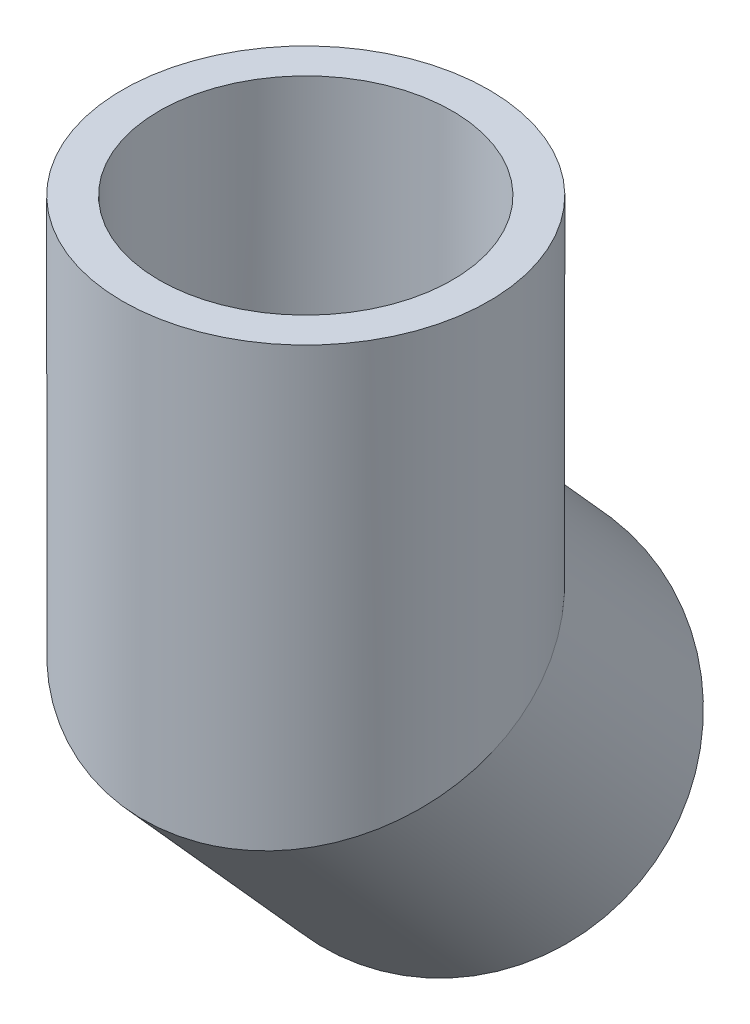
ISO-10303-21;
HEADER;
FILE_DESCRIPTION(('STEP AP214'),'2;1');
FILE_NAME('part.step','',(''),(''),'','','');
FILE_SCHEMA(('AUTOMOTIVE_DESIGN { 1 0 10303 214 1 1 1 1 }'));
ENDSEC;
DATA;
#1=APPLICATION_CONTEXT('core data for automotive mechanical design processes');
#2=APPLICATION_PROTOCOL_DEFINITION('international standard','automotive_design',2000,#1);
#3=PRODUCT_CONTEXT('',#1,'mechanical');
#4=PRODUCT('Part','Part','',(#3));
#5=PRODUCT_RELATED_PRODUCT_CATEGORY('part','',(#4));
#6=PRODUCT_DEFINITION_FORMATION('','',#4);
#7=PRODUCT_DEFINITION_CONTEXT('part definition',#1,'design');
#8=PRODUCT_DEFINITION('design','',#6,#7);
#9=PRODUCT_DEFINITION_SHAPE('','',#8);
#10=(LENGTH_UNIT() NAMED_UNIT(*) SI_UNIT(.MILLI.,.METRE.));
#11=(NAMED_UNIT(*) PLANE_ANGLE_UNIT() SI_UNIT($,.RADIAN.));
#12=(NAMED_UNIT(*) SI_UNIT($,.STERADIAN.) SOLID_ANGLE_UNIT());
#13=UNCERTAINTY_MEASURE_WITH_UNIT(LENGTH_MEASURE(1.E-05),#10,'distance_accuracy_value','');
#14=(GEOMETRIC_REPRESENTATION_CONTEXT(3) GLOBAL_UNCERTAINTY_ASSIGNED_CONTEXT((#13)) GLOBAL_UNIT_ASSIGNED_CONTEXT((#10,
#11,#12)) REPRESENTATION_CONTEXT('',''));
#15=CARTESIAN_POINT('',(0.,0.,0.));
#16=DIRECTION('',(0.,0.,1.));
#17=DIRECTION('',(1.,0.,0.));
#18=AXIS2_PLACEMENT_3D('',#15,#16,#17);
#19=CARTESIAN_POINT('',(2.39228867088973,-18.2937120751138,6.26508201435606));
#20=DIRECTION('',(-0.252241412937929,-0.707106781186546,-0.660586307456549));
#21=DIRECTION('',(0.,0.682660590064805,-0.730735601139271));
#22=AXIS2_PLACEMENT_3D('',#19,#20,#21);
#23=CYLINDRICAL_SURFACE('',#22,12.5);
#24=CARTESIAN_POINT('',(0.,-25.,0.));
#25=DIRECTION('',(-0.136512068977374,-0.923879532511286,-0.357506733405461));
#26=DIRECTION('',(0.329569288352787,-0.382683432365091,0.863097604427165));
#27=AXIS2_PLACEMENT_3D('',#24,#25,#26);
#28=ELLIPSE('',#27,13.5299025036549,12.5);
#29=CARTESIAN_POINT('',(4.45904033961214,-30.1776695296637,11.6776264390377));
#30=VERTEX_POINT('',#29);
#31=EDGE_CURVE('E40',#30,#30,#28,.T.);
#32=ORIENTED_EDGE('',*,*,#31,.T.);
#33=EDGE_LOOP('',(#32));
#34=FACE_BOUND('',#33,.T.);
#35=CARTESIAN_POINT('',(-6.30603532344823,-42.6776695296637,-16.5146576864137));
#36=DIRECTION('',(0.252241412937929,0.707106781186546,0.660586307456549));
#37=DIRECTION('',(-0.0976079677010439,-0.660586307456549,0.744377871139513));
#38=AXIS2_PLACEMENT_3D('',#35,#36,#37);
#39=CIRCLE('',#38,12.5);
#40=CARTESIAN_POINT('',(-7.52613491971128,-50.9349983728705,-7.20993429716981));
#41=VERTEX_POINT('',#40);
#42=EDGE_CURVE('E60',#41,#41,#39,.T.);
#43=ORIENTED_EDGE('',*,*,#42,.T.);
#44=EDGE_LOOP('',(#43));
#45=FACE_BOUND('',#44,.T.);
#46=ADVANCED_FACE('F37',(#34,#45),#23,.T.);
#47=CARTESIAN_POINT('',(0.,0.,0.));
#48=DIRECTION('',(0.,-1.,0.));
#49=DIRECTION('',(1.,0.,0.));
#50=AXIS2_PLACEMENT_3D('',#47,#48,#49);
#51=CYLINDRICAL_SURFACE('',#50,12.5);
#52=CARTESIAN_POINT('',(0.,0.,0.));
#53=DIRECTION('',(0.,1.,0.));
#54=DIRECTION('',(0.,0.,1.));
#55=AXIS2_PLACEMENT_3D('',#52,#53,#54);
#56=CIRCLE('',#55,12.5);
#57=CARTESIAN_POINT('',(0.,0.,12.5));
#58=VERTEX_POINT('',#57);
#59=EDGE_CURVE('E57',#58,#58,#56,.T.);
#60=ORIENTED_EDGE('',*,*,#59,.F.);
#61=EDGE_LOOP('',(#60));
#62=FACE_BOUND('',#61,.T.);
#63=ORIENTED_EDGE('',*,*,#31,.F.);
#64=EDGE_LOOP('',(#63));
#65=FACE_BOUND('',#64,.T.);
#66=ADVANCED_FACE('F70',(#62,#65),#51,.T.);
#67=CARTESIAN_POINT('',(-6.30603532344823,-42.6776695296637,-16.5146576864137));
#68=DIRECTION('',(0.252241412937929,0.707106781186546,0.660586307456549));
#69=DIRECTION('',(-0.0976079677010439,-0.660586307456549,0.744377871139513));
#70=AXIS2_PLACEMENT_3D('',#67,#68,#69);
#71=PLANE('',#70);
#72=CARTESIAN_POINT('',(-6.30603532344823,-42.6776695296637,-16.5146576864137));
#73=DIRECTION('',(0.252241412937929,0.707106781186546,0.660586307456549));
#74=DIRECTION('',(-0.0976079677010439,-0.660586307456549,0.744377871139513));
#75=AXIS2_PLACEMENT_3D('',#72,#73,#74);
#76=CIRCLE('',#75,10.);
#77=CARTESIAN_POINT('',(-7.28211500045867,-49.2835326042292,-9.07087897501859));
#78=VERTEX_POINT('',#77);
#79=EDGE_CURVE('E51',#78,#78,#76,.F.);
#80=ORIENTED_EDGE('',*,*,#79,.F.);
#81=EDGE_LOOP('',(#80));
#82=FACE_BOUND('',#81,.T.);
#83=ORIENTED_EDGE('',*,*,#42,.F.);
#84=EDGE_LOOP('',(#83));
#85=FACE_BOUND('',#84,.T.);
#86=ADVANCED_FACE('F72',(#82,#85),#71,.F.);
#87=CARTESIAN_POINT('',(0.,0.,0.));
#88=DIRECTION('',(0.,1.,0.));
#89=DIRECTION('',(0.,0.,1.));
#90=AXIS2_PLACEMENT_3D('',#87,#88,#89);
#91=PLANE('',#90);
#92=CARTESIAN_POINT('',(0.,0.,0.));
#93=DIRECTION('',(0.,1.,0.));
#94=DIRECTION('',(0.,0.,1.));
#95=AXIS2_PLACEMENT_3D('',#92,#93,#94);
#96=CIRCLE('',#95,10.);
#97=CARTESIAN_POINT('',(0.,0.,10.));
#98=VERTEX_POINT('',#97);
#99=EDGE_CURVE('E45',#98,#98,#96,.F.);
#100=ORIENTED_EDGE('',*,*,#99,.T.);
#101=EDGE_LOOP('',(#100));
#102=FACE_BOUND('',#101,.T.);
#103=ORIENTED_EDGE('',*,*,#59,.T.);
#104=EDGE_LOOP('',(#103));
#105=FACE_BOUND('',#104,.T.);
#106=ADVANCED_FACE('F78',(#102,#105),#91,.T.);
#107=CARTESIAN_POINT('',(1.91887576497054,-19.6208275244673,5.02527733763398));
#108=DIRECTION('',(-0.252241412937929,-0.707106781186546,-0.660586307456549));
#109=DIRECTION('',(0.,0.682660590064805,-0.730735601139271));
#110=AXIS2_PLACEMENT_3D('',#107,#108,#109);
#111=CYLINDRICAL_SURFACE('',#110,10.);
#112=CARTESIAN_POINT('',(0.,-25.,0.));
#113=DIRECTION('',(-0.136512068977374,-0.923879532511286,-0.357506733405461));
#114=DIRECTION('',(0.329569288352787,-0.382683432365091,0.863097604427165));
#115=AXIS2_PLACEMENT_3D('',#112,#113,#114);
#116=ELLIPSE('',#115,10.8239220029239,10.);
#117=CARTESIAN_POINT('',(3.56723227168972,-29.142135623731,9.34210115123014));
#118=VERTEX_POINT('',#117);
#119=EDGE_CURVE('E10',#118,#118,#116,.F.);
#120=ORIENTED_EDGE('',*,*,#119,.T.);
#121=EDGE_LOOP('',(#120));
#122=FACE_BOUND('',#121,.T.);
#123=ORIENTED_EDGE('',*,*,#79,.T.);
#124=EDGE_LOOP('',(#123));
#125=FACE_BOUND('',#124,.T.);
#126=ADVANCED_FACE('F84',(#122,#125),#111,.F.);
#127=CARTESIAN_POINT('',(0.,0.,0.));
#128=DIRECTION('',(0.,-1.,0.));
#129=DIRECTION('',(1.,0.,0.));
#130=AXIS2_PLACEMENT_3D('',#127,#128,#129);
#131=CYLINDRICAL_SURFACE('',#130,10.);
#132=ORIENTED_EDGE('',*,*,#99,.F.);
#133=EDGE_LOOP('',(#132));
#134=FACE_BOUND('',#133,.T.);
#135=ORIENTED_EDGE('',*,*,#119,.F.);
#136=EDGE_LOOP('',(#135));
#137=FACE_BOUND('',#136,.T.);
#138=ADVANCED_FACE('F82',(#134,#137),#131,.F.);
#139=CLOSED_SHELL('',(#46,#66,#86,#106,#126,#138));
#140=MANIFOLD_SOLID_BREP('B2',#139);
#141=ADVANCED_BREP_SHAPE_REPRESENTATION('',(#18,#140),#14);
#142=SHAPE_DEFINITION_REPRESENTATION(#9,#141);
ENDSEC;
END-ISO-10303-21;
